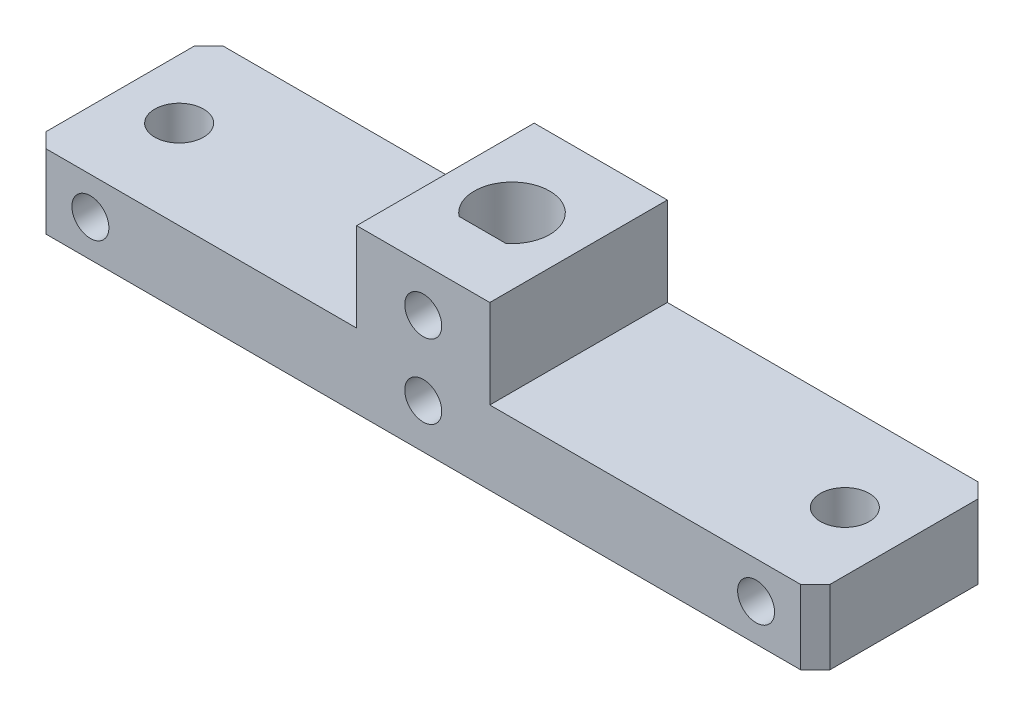
ISO-10303-21;
HEADER;
FILE_DESCRIPTION(('STEP AP214'),'2;1');
FILE_NAME('part.step','',(''),(''),'','','');
FILE_SCHEMA(('AUTOMOTIVE_DESIGN { 1 0 10303 214 1 1 1 1 }'));
ENDSEC;
DATA;
#1=APPLICATION_CONTEXT('core data for automotive mechanical design processes');
#2=APPLICATION_PROTOCOL_DEFINITION('international standard','automotive_design',2000,#1);
#3=PRODUCT_CONTEXT('',#1,'mechanical');
#4=PRODUCT('Part','Part','',(#3));
#5=PRODUCT_RELATED_PRODUCT_CATEGORY('part','',(#4));
#6=PRODUCT_DEFINITION_FORMATION('','',#4);
#7=PRODUCT_DEFINITION_CONTEXT('part definition',#1,'design');
#8=PRODUCT_DEFINITION('design','',#6,#7);
#9=PRODUCT_DEFINITION_SHAPE('','',#8);
#10=(LENGTH_UNIT() NAMED_UNIT(*) SI_UNIT(.MILLI.,.METRE.));
#11=(NAMED_UNIT(*) PLANE_ANGLE_UNIT() SI_UNIT($,.RADIAN.));
#12=(NAMED_UNIT(*) SI_UNIT($,.STERADIAN.) SOLID_ANGLE_UNIT());
#13=UNCERTAINTY_MEASURE_WITH_UNIT(LENGTH_MEASURE(1.E-05),#10,'distance_accuracy_value','');
#14=(GEOMETRIC_REPRESENTATION_CONTEXT(3) GLOBAL_UNCERTAINTY_ASSIGNED_CONTEXT((#13)) GLOBAL_UNIT_ASSIGNED_CONTEXT((#10,
#11,#12)) REPRESENTATION_CONTEXT('',''));
#15=CARTESIAN_POINT('',(0.,0.,0.));
#16=DIRECTION('',(0.,0.,1.));
#17=DIRECTION('',(1.,0.,0.));
#18=AXIS2_PLACEMENT_3D('',#15,#16,#17);
#19=CARTESIAN_POINT('',(4.5,11.,-12.));
#20=DIRECTION('',(0.,1.,0.));
#21=DIRECTION('',(0.,0.,1.));
#22=AXIS2_PLACEMENT_3D('',#19,#20,#21);
#23=PLANE('',#22);
#24=DIRECTION('',(-1.,0.,0.));
#25=VECTOR('',#24,1.);
#26=CARTESIAN_POINT('',(4.5,11.,0.));
#27=LINE('',#26,#25);
#28=CARTESIAN_POINT('',(4.5,11.,0.));
#29=VERTEX_POINT('',#28);
#30=CARTESIAN_POINT('',(-4.5,11.,0.));
#31=VERTEX_POINT('',#30);
#32=EDGE_CURVE('E241',#29,#31,#27,.T.);
#33=ORIENTED_EDGE('',*,*,#32,.F.);
#34=DIRECTION('',(0.,0.,1.));
#35=VECTOR('',#34,1.);
#36=CARTESIAN_POINT('',(4.5,11.,-12.));
#37=LINE('',#36,#35);
#38=CARTESIAN_POINT('',(4.5,11.,-12.));
#39=VERTEX_POINT('',#38);
#40=EDGE_CURVE('E263',#39,#29,#37,.T.);
#41=ORIENTED_EDGE('',*,*,#40,.F.);
#42=DIRECTION('',(-1.,0.,0.));
#43=VECTOR('',#42,1.);
#44=CARTESIAN_POINT('',(4.5,11.,-12.));
#45=LINE('',#44,#43);
#46=CARTESIAN_POINT('',(-4.5,11.,-12.));
#47=VERTEX_POINT('',#46);
#48=EDGE_CURVE('E218',#39,#47,#45,.T.);
#49=ORIENTED_EDGE('',*,*,#48,.T.);
#50=DIRECTION('',(0.,0.,1.));
#51=VECTOR('',#50,1.);
#52=CARTESIAN_POINT('',(-4.5,11.,-12.));
#53=LINE('',#52,#51);
#54=EDGE_CURVE('E260',#47,#31,#53,.T.);
#55=ORIENTED_EDGE('',*,*,#54,.T.);
#56=EDGE_LOOP('',(#33,#41,#49,#55));
#57=FACE_BOUND('',#56,.T.);
#58=DIRECTION('',(1.,0.,0.));
#59=VECTOR('',#58,1.);
#60=CARTESIAN_POINT('',(-1.58192920195564,11.,-4.));
#61=LINE('',#60,#59);
#62=CARTESIAN_POINT('',(-1.58192920195564,11.,-4.));
#63=VERTEX_POINT('',#62);
#64=CARTESIAN_POINT('',(1.58192920195564,11.,-4.));
#65=VERTEX_POINT('',#64);
#66=EDGE_CURVE('E156',#63,#65,#61,.T.);
#67=ORIENTED_EDGE('',*,*,#66,.F.);
#68=CARTESIAN_POINT('',(0.,11.,-6.));
#69=DIRECTION('',(0.,1.,0.));
#70=DIRECTION('',(0.,0.,1.));
#71=AXIS2_PLACEMENT_3D('',#68,#69,#70);
#72=CIRCLE('',#71,2.55);
#73=EDGE_CURVE('E167',#65,#63,#72,.T.);
#74=ORIENTED_EDGE('',*,*,#73,.F.);
#75=EDGE_LOOP('',(#67,#74));
#76=FACE_BOUND('',#75,.T.);
#77=ADVANCED_FACE('F52',(#57,#76),#23,.T.);
#78=CARTESIAN_POINT('',(-26.5,0.,-12.));
#79=DIRECTION('',(0.,-1.,0.));
#80=DIRECTION('',(0.,0.,-1.));
#81=AXIS2_PLACEMENT_3D('',#78,#79,#80);
#82=PLANE('',#81);
#83=CARTESIAN_POINT('',(-22.5,0.,-6.));
#84=DIRECTION('',(0.,-1.,0.));
#85=DIRECTION('',(0.,0.,-1.));
#86=AXIS2_PLACEMENT_3D('',#83,#84,#85);
#87=CIRCLE('',#86,1.64999999999999);
#88=CARTESIAN_POINT('',(-22.5,0.,-7.64999999999999));
#89=VERTEX_POINT('',#88);
#90=EDGE_CURVE('E189',#89,#89,#87,.T.);
#91=ORIENTED_EDGE('',*,*,#90,.F.);
#92=EDGE_LOOP('',(#91));
#93=FACE_BOUND('',#92,.T.);
#94=CARTESIAN_POINT('',(22.5,0.,-6.00000000000001));
#95=DIRECTION('',(0.,-1.,0.));
#96=DIRECTION('',(0.,0.,-1.));
#97=AXIS2_PLACEMENT_3D('',#94,#95,#96);
#98=CIRCLE('',#97,1.64999999999999);
#99=CARTESIAN_POINT('',(22.5,0.,-7.65));
#100=VERTEX_POINT('',#99);
#101=EDGE_CURVE('E197',#100,#100,#98,.T.);
#102=ORIENTED_EDGE('',*,*,#101,.F.);
#103=EDGE_LOOP('',(#102));
#104=FACE_BOUND('',#103,.T.);
#105=DIRECTION('',(0.,0.,1.));
#106=VECTOR('',#105,1.);
#107=CARTESIAN_POINT('',(-26.5,0.,-12.));
#108=LINE('',#107,#106);
#109=CARTESIAN_POINT('',(-26.5,0.,-11.));
#110=VERTEX_POINT('',#109);
#111=CARTESIAN_POINT('',(-26.5,0.,-1.));
#112=VERTEX_POINT('',#111);
#113=EDGE_CURVE('E230',#110,#112,#108,.T.);
#114=ORIENTED_EDGE('',*,*,#113,.F.);
#115=DIRECTION('',(0.707106781186549,0.,-0.707106781186546));
#116=VECTOR('',#115,1.);
#117=CARTESIAN_POINT('',(-26.,0.,-11.5));
#118=LINE('',#117,#116);
#119=CARTESIAN_POINT('',(-25.5,0.,-12.));
#120=VERTEX_POINT('',#119);
#121=EDGE_CURVE('E295',#110,#120,#118,.T.);
#122=ORIENTED_EDGE('',*,*,#121,.T.);
#123=DIRECTION('',(1.,0.,0.));
#124=VECTOR('',#123,1.);
#125=CARTESIAN_POINT('',(-26.5,0.,-12.));
#126=LINE('',#125,#124);
#127=CARTESIAN_POINT('',(25.5,0.,-12.));
#128=VERTEX_POINT('',#127);
#129=EDGE_CURVE('E206',#120,#128,#126,.T.);
#130=ORIENTED_EDGE('',*,*,#129,.T.);
#131=DIRECTION('',(0.70710678118655,0.,0.707106781186545));
#132=VECTOR('',#131,1.);
#133=CARTESIAN_POINT('',(-0.500000000000184,0.,-38.));
#134=LINE('',#133,#132);
#135=CARTESIAN_POINT('',(26.5,0.,-11.));
#136=VERTEX_POINT('',#135);
#137=EDGE_CURVE('E289',#128,#136,#134,.T.);
#138=ORIENTED_EDGE('',*,*,#137,.T.);
#139=DIRECTION('',(0.,0.,1.));
#140=VECTOR('',#139,1.);
#141=CARTESIAN_POINT('',(26.5,0.,-12.));
#142=LINE('',#141,#140);
#143=CARTESIAN_POINT('',(26.5,0.,-1.));
#144=VERTEX_POINT('',#143);
#145=EDGE_CURVE('E273',#136,#144,#142,.T.);
#146=ORIENTED_EDGE('',*,*,#145,.T.);
#147=DIRECTION('',(0.707106781186548,0.,-0.707106781186548));
#148=VECTOR('',#147,1.);
#149=CARTESIAN_POINT('',(5.5,0.,20.));
#150=LINE('',#149,#148);
#151=CARTESIAN_POINT('',(25.5,0.,0.));
#152=VERTEX_POINT('',#151);
#153=EDGE_CURVE('E286',#144,#152,#150,.F.);
#154=ORIENTED_EDGE('',*,*,#153,.T.);
#155=DIRECTION('',(1.,0.,0.));
#156=VECTOR('',#155,1.);
#157=CARTESIAN_POINT('',(-26.5,0.,0.));
#158=LINE('',#157,#156);
#159=CARTESIAN_POINT('',(-25.5,0.,0.));
#160=VERTEX_POINT('',#159);
#161=EDGE_CURVE('E205',#160,#152,#158,.T.);
#162=ORIENTED_EDGE('',*,*,#161,.F.);
#163=DIRECTION('',(0.707106781186544,0.,0.707106781186551));
#164=VECTOR('',#163,1.);
#165=CARTESIAN_POINT('',(-32.,0.,-6.50000000000005));
#166=LINE('',#165,#164);
#167=EDGE_CURVE('E292',#160,#112,#166,.F.);
#168=ORIENTED_EDGE('',*,*,#167,.T.);
#169=EDGE_LOOP('',(#114,#122,#130,#138,#146,#154,#162,#168));
#170=FACE_BOUND('',#169,.T.);
#171=DIRECTION('',(1.,0.,0.));
#172=VECTOR('',#171,1.);
#173=CARTESIAN_POINT('',(-1.58192920195564,0.,-4.));
#174=LINE('',#173,#172);
#175=CARTESIAN_POINT('',(-1.58192920195564,0.,-4.));
#176=VERTEX_POINT('',#175);
#177=CARTESIAN_POINT('',(1.58192920195564,0.,-4.));
#178=VERTEX_POINT('',#177);
#179=EDGE_CURVE('E176',#176,#178,#174,.T.);
#180=ORIENTED_EDGE('',*,*,#179,.T.);
#181=CARTESIAN_POINT('',(0.,0.,-6.));
#182=DIRECTION('',(0.,1.,0.));
#183=DIRECTION('',(0.,0.,1.));
#184=AXIS2_PLACEMENT_3D('',#181,#182,#183);
#185=CIRCLE('',#184,2.55);
#186=EDGE_CURVE('E172',#178,#176,#185,.T.);
#187=ORIENTED_EDGE('',*,*,#186,.T.);
#188=EDGE_LOOP('',(#180,#187));
#189=FACE_BOUND('',#188,.T.);
#190=ADVANCED_FACE('F441',(#93,#104,#170,#189),#82,.T.);
#191=CARTESIAN_POINT('',(-26.5,5.,-12.));
#192=DIRECTION('',(-1.,0.,0.));
#193=DIRECTION('',(0.,-1.,0.));
#194=AXIS2_PLACEMENT_3D('',#191,#192,#193);
#195=PLANE('',#194);
#196=DIRECTION('',(0.,0.,1.));
#197=VECTOR('',#196,1.);
#198=CARTESIAN_POINT('',(-26.5,5.,-12.));
#199=LINE('',#198,#197);
#200=CARTESIAN_POINT('',(-26.5,5.,-11.));
#201=VERTEX_POINT('',#200);
#202=CARTESIAN_POINT('',(-26.5,5.,-1.));
#203=VERTEX_POINT('',#202);
#204=EDGE_CURVE('E252',#201,#203,#199,.T.);
#205=ORIENTED_EDGE('',*,*,#204,.F.);
#206=DIRECTION('',(0.,-1.,0.));
#207=VECTOR('',#206,1.);
#208=CARTESIAN_POINT('',(-26.5,0.,-11.));
#209=LINE('',#208,#207);
#210=EDGE_CURVE('E282',#201,#110,#209,.T.);
#211=ORIENTED_EDGE('',*,*,#210,.T.);
#212=ORIENTED_EDGE('',*,*,#113,.T.);
#213=DIRECTION('',(0.,1.,0.));
#214=VECTOR('',#213,1.);
#215=CARTESIAN_POINT('',(-26.5,5.,-1.));
#216=LINE('',#215,#214);
#217=EDGE_CURVE('E256',#112,#203,#216,.T.);
#218=ORIENTED_EDGE('',*,*,#217,.T.);
#219=EDGE_LOOP('',(#205,#211,#212,#218));
#220=FACE_BOUND('',#219,.T.);
#221=ADVANCED_FACE('F447',(#220),#195,.T.);
#222=CARTESIAN_POINT('',(-4.5,5.,-12.));
#223=DIRECTION('',(0.,1.,0.));
#224=DIRECTION('',(-1.,0.,0.));
#225=AXIS2_PLACEMENT_3D('',#222,#223,#224);
#226=PLANE('',#225);
#227=CARTESIAN_POINT('',(-22.5,5.,-6.));
#228=DIRECTION('',(0.,1.,0.));
#229=DIRECTION('',(-1.,0.,0.));
#230=AXIS2_PLACEMENT_3D('',#227,#228,#229);
#231=CIRCLE('',#230,1.64999999999999);
#232=CARTESIAN_POINT('',(-24.15,5.,-6.));
#233=VERTEX_POINT('',#232);
#234=EDGE_CURVE('E193',#233,#233,#231,.T.);
#235=ORIENTED_EDGE('',*,*,#234,.F.);
#236=EDGE_LOOP('',(#235));
#237=FACE_BOUND('',#236,.T.);
#238=DIRECTION('',(-1.,0.,0.));
#239=VECTOR('',#238,1.);
#240=CARTESIAN_POINT('',(-4.5,5.,-12.));
#241=LINE('',#240,#239);
#242=CARTESIAN_POINT('',(-4.5,5.,-12.));
#243=VERTEX_POINT('',#242);
#244=CARTESIAN_POINT('',(-25.5,5.,-12.));
#245=VERTEX_POINT('',#244);
#246=EDGE_CURVE('E226',#243,#245,#241,.T.);
#247=ORIENTED_EDGE('',*,*,#246,.T.);
#248=DIRECTION('',(-0.707106781186549,0.,0.707106781186546));
#249=VECTOR('',#248,1.);
#250=CARTESIAN_POINT('',(-15.,5.,-22.5));
#251=LINE('',#250,#249);
#252=EDGE_CURVE('E307',#245,#201,#251,.T.);
#253=ORIENTED_EDGE('',*,*,#252,.T.);
#254=ORIENTED_EDGE('',*,*,#204,.T.);
#255=DIRECTION('',(-0.707106781186544,0.,-0.707106781186551));
#256=VECTOR('',#255,1.);
#257=CARTESIAN_POINT('',(-21.0000000000001,5.,4.49999999999994));
#258=LINE('',#257,#256);
#259=CARTESIAN_POINT('',(-25.5,5.,0.));
#260=VERTEX_POINT('',#259);
#261=EDGE_CURVE('E304',#203,#260,#258,.F.);
#262=ORIENTED_EDGE('',*,*,#261,.T.);
#263=DIRECTION('',(-1.,0.,0.));
#264=VECTOR('',#263,1.);
#265=CARTESIAN_POINT('',(-4.5,5.,0.));
#266=LINE('',#265,#264);
#267=CARTESIAN_POINT('',(-4.5,5.,0.));
#268=VERTEX_POINT('',#267);
#269=EDGE_CURVE('E211',#268,#260,#266,.T.);
#270=ORIENTED_EDGE('',*,*,#269,.F.);
#271=DIRECTION('',(0.,0.,1.));
#272=VECTOR('',#271,1.);
#273=CARTESIAN_POINT('',(-4.5,5.,-12.));
#274=LINE('',#273,#272);
#275=EDGE_CURVE('E257',#243,#268,#274,.T.);
#276=ORIENTED_EDGE('',*,*,#275,.F.);
#277=EDGE_LOOP('',(#247,#253,#254,#262,#270,#276));
#278=FACE_BOUND('',#277,.T.);
#279=ADVANCED_FACE('F469',(#237,#278),#226,.T.);
#280=CARTESIAN_POINT('',(-4.5,11.,-12.));
#281=DIRECTION('',(-1.,0.,0.));
#282=DIRECTION('',(0.,-1.,0.));
#283=AXIS2_PLACEMENT_3D('',#280,#281,#282);
#284=PLANE('',#283);
#285=DIRECTION('',(0.,-1.,0.));
#286=VECTOR('',#285,1.);
#287=CARTESIAN_POINT('',(-4.5,11.,0.));
#288=LINE('',#287,#286);
#289=EDGE_CURVE('E245',#31,#268,#288,.T.);
#290=ORIENTED_EDGE('',*,*,#289,.F.);
#291=ORIENTED_EDGE('',*,*,#54,.F.);
#292=DIRECTION('',(0.,-1.,0.));
#293=VECTOR('',#292,1.);
#294=CARTESIAN_POINT('',(-4.5,11.,-12.));
#295=LINE('',#294,#293);
#296=EDGE_CURVE('E222',#47,#243,#295,.T.);
#297=ORIENTED_EDGE('',*,*,#296,.T.);
#298=ORIENTED_EDGE('',*,*,#275,.T.);
#299=EDGE_LOOP('',(#290,#291,#297,#298));
#300=FACE_BOUND('',#299,.T.);
#301=ADVANCED_FACE('F453',(#300),#284,.T.);
#302=CARTESIAN_POINT('',(4.50000000000001,5.,-12.));
#303=DIRECTION('',(1.,0.,0.));
#304=DIRECTION('',(0.,1.,0.));
#305=AXIS2_PLACEMENT_3D('',#302,#303,#304);
#306=PLANE('',#305);
#307=DIRECTION('',(0.,1.,0.));
#308=VECTOR('',#307,1.);
#309=CARTESIAN_POINT('',(4.50000000000001,5.,0.));
#310=LINE('',#309,#308);
#311=CARTESIAN_POINT('',(4.50000000000001,5.,0.));
#312=VERTEX_POINT('',#311);
#313=EDGE_CURVE('E237',#312,#29,#310,.T.);
#314=ORIENTED_EDGE('',*,*,#313,.F.);
#315=DIRECTION('',(0.,0.,1.));
#316=VECTOR('',#315,1.);
#317=CARTESIAN_POINT('',(4.50000000000001,5.,-12.));
#318=LINE('',#317,#316);
#319=CARTESIAN_POINT('',(4.50000000000001,5.,-12.));
#320=VERTEX_POINT('',#319);
#321=EDGE_CURVE('E266',#320,#312,#318,.T.);
#322=ORIENTED_EDGE('',*,*,#321,.F.);
#323=DIRECTION('',(0.,1.,0.));
#324=VECTOR('',#323,1.);
#325=CARTESIAN_POINT('',(4.50000000000001,5.,-12.));
#326=LINE('',#325,#324);
#327=EDGE_CURVE('E214',#320,#39,#326,.T.);
#328=ORIENTED_EDGE('',*,*,#327,.T.);
#329=ORIENTED_EDGE('',*,*,#40,.T.);
#330=EDGE_LOOP('',(#314,#322,#328,#329));
#331=FACE_BOUND('',#330,.T.);
#332=ADVANCED_FACE('F455',(#331),#306,.T.);
#333=CARTESIAN_POINT('',(26.5,5.00000000000003,-12.));
#334=DIRECTION('',(0.,1.,0.));
#335=DIRECTION('',(-1.,0.,0.));
#336=AXIS2_PLACEMENT_3D('',#333,#334,#335);
#337=PLANE('',#336);
#338=CARTESIAN_POINT('',(22.5,5.00000000000003,-6.00000000000001));
#339=DIRECTION('',(0.,1.,0.));
#340=DIRECTION('',(-1.,0.,0.));
#341=AXIS2_PLACEMENT_3D('',#338,#339,#340);
#342=CIRCLE('',#341,1.64999999999999);
#343=CARTESIAN_POINT('',(20.85,5.00000000000003,-6.00000000000001));
#344=VERTEX_POINT('',#343);
#345=EDGE_CURVE('E201',#344,#344,#342,.T.);
#346=ORIENTED_EDGE('',*,*,#345,.F.);
#347=EDGE_LOOP('',(#346));
#348=FACE_BOUND('',#347,.T.);
#349=DIRECTION('',(0.,0.,1.));
#350=VECTOR('',#349,1.);
#351=CARTESIAN_POINT('',(26.5,5.00000000000003,-12.));
#352=LINE('',#351,#350);
#353=CARTESIAN_POINT('',(26.5,5.00000000000003,-11.));
#354=VERTEX_POINT('',#353);
#355=CARTESIAN_POINT('',(26.5,5.00000000000003,-1.));
#356=VERTEX_POINT('',#355);
#357=EDGE_CURVE('E270',#354,#356,#352,.T.);
#358=ORIENTED_EDGE('',*,*,#357,.F.);
#359=DIRECTION('',(-0.70710678118655,0.,-0.707106781186545));
#360=VECTOR('',#359,1.);
#361=CARTESIAN_POINT('',(26.,5.00000000000003,-11.5));
#362=LINE('',#361,#360);
#363=CARTESIAN_POINT('',(25.5,5.00000000000003,-12.));
#364=VERTEX_POINT('',#363);
#365=EDGE_CURVE('E11',#354,#364,#362,.T.);
#366=ORIENTED_EDGE('',*,*,#365,.T.);
#367=DIRECTION('',(-1.,0.,0.));
#368=VECTOR('',#367,1.);
#369=CARTESIAN_POINT('',(26.5,5.00000000000003,-12.));
#370=LINE('',#369,#368);
#371=EDGE_CURVE('E210',#364,#320,#370,.T.);
#372=ORIENTED_EDGE('',*,*,#371,.T.);
#373=ORIENTED_EDGE('',*,*,#321,.T.);
#374=DIRECTION('',(-1.,0.,0.));
#375=VECTOR('',#374,1.);
#376=CARTESIAN_POINT('',(26.5,5.00000000000003,0.));
#377=LINE('',#376,#375);
#378=CARTESIAN_POINT('',(25.5,5.00000000000003,0.));
#379=VERTEX_POINT('',#378);
#380=EDGE_CURVE('E234',#379,#312,#377,.T.);
#381=ORIENTED_EDGE('',*,*,#380,.F.);
#382=DIRECTION('',(-0.707106781186548,0.,0.707106781186548));
#383=VECTOR('',#382,1.);
#384=CARTESIAN_POINT('',(32.,5.00000000000003,-6.5));
#385=LINE('',#384,#383);
#386=EDGE_CURVE('E62',#379,#356,#385,.F.);
#387=ORIENTED_EDGE('',*,*,#386,.T.);
#388=EDGE_LOOP('',(#358,#366,#372,#373,#381,#387));
#389=FACE_BOUND('',#388,.T.);
#390=ADVANCED_FACE('F458',(#348,#389),#337,.T.);
#391=CARTESIAN_POINT('',(26.5,0.,-12.));
#392=DIRECTION('',(1.,0.,0.));
#393=DIRECTION('',(0.,1.,0.));
#394=AXIS2_PLACEMENT_3D('',#391,#392,#393);
#395=PLANE('',#394);
#396=ORIENTED_EDGE('',*,*,#145,.F.);
#397=DIRECTION('',(0.,1.,0.));
#398=VECTOR('',#397,1.);
#399=CARTESIAN_POINT('',(26.5,5.00000000000003,-11.));
#400=LINE('',#399,#398);
#401=EDGE_CURVE('E321',#136,#354,#400,.T.);
#402=ORIENTED_EDGE('',*,*,#401,.T.);
#403=ORIENTED_EDGE('',*,*,#357,.T.);
#404=DIRECTION('',(0.,-1.,0.));
#405=VECTOR('',#404,1.);
#406=CARTESIAN_POINT('',(26.5,0.,-1.));
#407=LINE('',#406,#405);
#408=EDGE_CURVE('E318',#356,#144,#407,.T.);
#409=ORIENTED_EDGE('',*,*,#408,.T.);
#410=EDGE_LOOP('',(#396,#402,#403,#409));
#411=FACE_BOUND('',#410,.T.);
#412=ADVANCED_FACE('F462',(#411),#395,.T.);
#413=CARTESIAN_POINT('',(0.,0.,-12.));
#414=DIRECTION('',(0.,0.,1.));
#415=DIRECTION('',(1.,0.,0.));
#416=AXIS2_PLACEMENT_3D('',#413,#414,#415);
#417=PLANE('',#416);
#418=ORIENTED_EDGE('',*,*,#129,.F.);
#419=DIRECTION('',(0.,1.,0.));
#420=VECTOR('',#419,1.);
#421=CARTESIAN_POINT('',(-25.5,5.,-12.));
#422=LINE('',#421,#420);
#423=EDGE_CURVE('E301',#120,#245,#422,.T.);
#424=ORIENTED_EDGE('',*,*,#423,.T.);
#425=ORIENTED_EDGE('',*,*,#246,.F.);
#426=ORIENTED_EDGE('',*,*,#296,.F.);
#427=ORIENTED_EDGE('',*,*,#48,.F.);
#428=ORIENTED_EDGE('',*,*,#327,.F.);
#429=ORIENTED_EDGE('',*,*,#371,.F.);
#430=DIRECTION('',(0.,-1.,0.));
#431=VECTOR('',#430,1.);
#432=CARTESIAN_POINT('',(25.5,0.,-12.));
#433=LINE('',#432,#431);
#434=EDGE_CURVE('E298',#364,#128,#433,.T.);
#435=ORIENTED_EDGE('',*,*,#434,.T.);
#436=EDGE_LOOP('',(#418,#424,#425,#426,#427,#428,#429,#435));
#437=FACE_BOUND('',#436,.T.);
#438=ADVANCED_FACE('F465',(#437),#417,.F.);
#439=CARTESIAN_POINT('',(0.,0.,0.));
#440=DIRECTION('',(0.,0.,1.));
#441=DIRECTION('',(1.,0.,0.));
#442=AXIS2_PLACEMENT_3D('',#439,#440,#441);
#443=PLANE('',#442);
#444=CARTESIAN_POINT('',(-22.5,2.50000000000003,0.));
#445=DIRECTION('',(0.,0.,1.));
#446=DIRECTION('',(1.,0.,0.));
#447=AXIS2_PLACEMENT_3D('',#444,#445,#446);
#448=CIRCLE('',#447,1.24999999999999);
#449=CARTESIAN_POINT('',(-21.25,2.50000000000003,0.));
#450=VERTEX_POINT('',#449);
#451=EDGE_CURVE('E410',#450,#450,#448,.T.);
#452=ORIENTED_EDGE('',*,*,#451,.F.);
#453=EDGE_LOOP('',(#452));
#454=FACE_BOUND('',#453,.T.);
#455=CARTESIAN_POINT('',(22.5,2.50000000000003,0.));
#456=DIRECTION('',(0.,0.,1.));
#457=DIRECTION('',(1.,0.,0.));
#458=AXIS2_PLACEMENT_3D('',#455,#456,#457);
#459=CIRCLE('',#458,1.24999999999999);
#460=CARTESIAN_POINT('',(23.75,2.50000000000003,0.));
#461=VERTEX_POINT('',#460);
#462=EDGE_CURVE('E400',#461,#461,#459,.T.);
#463=ORIENTED_EDGE('',*,*,#462,.F.);
#464=EDGE_LOOP('',(#463));
#465=FACE_BOUND('',#464,.T.);
#466=CARTESIAN_POINT('',(0.,8.00000000000001,0.));
#467=DIRECTION('',(0.,0.,1.));
#468=DIRECTION('',(1.,0.,0.));
#469=AXIS2_PLACEMENT_3D('',#466,#467,#468);
#470=CIRCLE('',#469,1.24999999999999);
#471=CARTESIAN_POINT('',(1.24999999999999,8.00000000000001,0.));
#472=VERTEX_POINT('',#471);
#473=EDGE_CURVE('E390',#472,#472,#470,.T.);
#474=ORIENTED_EDGE('',*,*,#473,.F.);
#475=EDGE_LOOP('',(#474));
#476=FACE_BOUND('',#475,.T.);
#477=CARTESIAN_POINT('',(0.,3.,0.));
#478=DIRECTION('',(0.,0.,1.));
#479=DIRECTION('',(1.,0.,0.));
#480=AXIS2_PLACEMENT_3D('',#477,#478,#479);
#481=CIRCLE('',#480,1.24999999999999);
#482=CARTESIAN_POINT('',(1.24999999999999,3.,0.));
#483=VERTEX_POINT('',#482);
#484=EDGE_CURVE('E379',#483,#483,#481,.T.);
#485=ORIENTED_EDGE('',*,*,#484,.F.);
#486=EDGE_LOOP('',(#485));
#487=FACE_BOUND('',#486,.T.);
#488=ORIENTED_EDGE('',*,*,#269,.T.);
#489=DIRECTION('',(0.,-1.,0.));
#490=VECTOR('',#489,1.);
#491=CARTESIAN_POINT('',(-25.5,0.,0.));
#492=LINE('',#491,#490);
#493=EDGE_CURVE('E314',#260,#160,#492,.T.);
#494=ORIENTED_EDGE('',*,*,#493,.T.);
#495=ORIENTED_EDGE('',*,*,#161,.T.);
#496=DIRECTION('',(0.,1.,0.));
#497=VECTOR('',#496,1.);
#498=CARTESIAN_POINT('',(25.5,0.,0.));
#499=LINE('',#498,#497);
#500=EDGE_CURVE('E310',#152,#379,#499,.T.);
#501=ORIENTED_EDGE('',*,*,#500,.T.);
#502=ORIENTED_EDGE('',*,*,#380,.T.);
#503=ORIENTED_EDGE('',*,*,#313,.T.);
#504=ORIENTED_EDGE('',*,*,#32,.T.);
#505=ORIENTED_EDGE('',*,*,#289,.T.);
#506=EDGE_LOOP('',(#488,#494,#495,#501,#502,#503,#504,#505));
#507=FACE_BOUND('',#506,.T.);
#508=ADVANCED_FACE('F500',(#454,#465,#476,#487,#507),#443,.T.);
#509=CARTESIAN_POINT('',(22.5,0.,-6.00000000000001));
#510=DIRECTION('',(0.,-1.,0.));
#511=DIRECTION('',(0.,0.,-1.));
#512=AXIS2_PLACEMENT_3D('',#509,#510,#511);
#513=CYLINDRICAL_SURFACE('',#512,1.64999999999999);
#514=CARTESIAN_POINT('',(23.75,2.50000000000003,-4.92296703857311));
#515=CARTESIAN_POINT('',(23.7499921483348,2.55804444947865,-4.9229506207044));
#516=CARTESIAN_POINT('',(23.7459045043683,2.61615010984884,-4.91815796381316));
#517=CARTESIAN_POINT('',(23.7300143019573,2.73000921003107,-4.90013950186176));
#518=CARTESIAN_POINT('',(23.71818411429,2.78575346177427,-4.88688349956445));
#519=CARTESIAN_POINT('',(23.68465710464,2.9045275214471,-4.85117667918063));
#520=CARTESIAN_POINT('',(23.6614345663849,2.96670753358605,-4.82739784255901));
#521=CARTESIAN_POINT('',(23.6065157798252,3.08514856837618,-4.77543690815317));
#522=CARTESIAN_POINT('',(23.5748083158257,3.14140161837279,-4.74724900293594));
#523=CARTESIAN_POINT('',(23.5027639216693,3.24917223550719,-4.68882921463891));
#524=CARTESIAN_POINT('',(23.4622428748645,3.30054865524437,-4.65856498290385));
#525=CARTESIAN_POINT('',(23.3733781324916,3.39665360876358,-4.59908283015536));
#526=CARTESIAN_POINT('',(23.32504118386,3.44138781299345,-4.56986403302234));
#527=CARTESIAN_POINT('',(23.2229582143096,3.52169800074396,-4.51573998036955));
#528=CARTESIAN_POINT('',(23.1695231151998,3.55757884643994,-4.49070539859495));
#529=CARTESIAN_POINT('',(23.0561837071499,3.62132977676979,-4.44536855952226));
#530=CARTESIAN_POINT('',(22.9962807463545,3.64920152638179,-4.42506531881124));
#531=CARTESIAN_POINT('',(22.8705523445062,3.69570798998144,-4.39081775286639));
#532=CARTESIAN_POINT('',(22.8046782771455,3.71425695876182,-4.3769325470547));
#533=CARTESIAN_POINT('',(22.6696270530949,3.74033761016006,-4.35733101137912));
#534=CARTESIAN_POINT('',(22.6004542420776,3.74788339544632,-4.35160422516909));
#535=CARTESIAN_POINT('',(22.4723010114039,3.75107947180414,-4.34918155835974));
#536=CARTESIAN_POINT('',(22.4133772633778,3.74837036924069,-4.35124010682931));
#537=CARTESIAN_POINT('',(22.2970295910036,3.73480014646176,-4.36149114691154));
#538=CARTESIAN_POINT('',(22.2396056973932,3.72393885931194,-4.36968376413306));
#539=CARTESIAN_POINT('',(22.1295466032159,3.69515890437942,-4.39117532342631));
#540=CARTESIAN_POINT('',(22.0768185270377,3.67746703813317,-4.40430985009125));
#541=CARTESIAN_POINT('',(21.9752154394935,3.63583372063106,-4.43477882554458));
#542=CARTESIAN_POINT('',(21.9263410999158,3.61189118287245,-4.45211400446008));
#543=CARTESIAN_POINT('',(21.8268673347571,3.5550332599328,-4.49247196828303));
#544=CARTESIAN_POINT('',(21.7768912202744,3.52135076758441,-4.51594341289907));
#545=CARTESIAN_POINT('',(21.6830053100023,3.44793370033148,-4.5654813670753));
#546=CARTESIAN_POINT('',(21.6391027922312,3.4081919824164,-4.59155092673296));
#547=CARTESIAN_POINT('',(21.5493096071294,3.31468226190858,-4.65014409939101));
#548=CARTESIAN_POINT('',(21.5048287718293,3.25970520804199,-4.6829024759048));
#549=CARTESIAN_POINT('',(21.4253747416773,3.1424155087261,-4.74689470938858));
#550=CARTESIAN_POINT('',(21.390399407328,3.08010451853082,-4.77812890811966));
#551=CARTESIAN_POINT('',(21.3392287078819,2.96671138095956,-4.82697254482192));
#552=CARTESIAN_POINT('',(21.320516699323,2.91736084078879,-4.84594970306178));
#553=CARTESIAN_POINT('',(21.2892141947835,2.81517834637323,-4.87883303402231));
#554=CARTESIAN_POINT('',(21.2766091127434,2.76235503314396,-4.89275126962476));
#555=CARTESIAN_POINT('',(21.2597432392205,2.66251402167054,-4.91169787402625));
#556=CARTESIAN_POINT('',(21.2544904872187,2.61586895469849,-4.91777126377215));
#557=CARTESIAN_POINT('',(21.2493084769088,2.52190040120287,-4.92376159857673));
#558=CARTESIAN_POINT('',(21.2493751017824,2.47457746766079,-4.92368330460056));
#559=CARTESIAN_POINT('',(21.254813533365,2.3807655995133,-4.91739899374116));
#560=CARTESIAN_POINT('',(21.2601751416252,2.33427523657488,-4.91120475652845));
#561=CARTESIAN_POINT('',(21.2758045634883,2.24310908867572,-4.89366336202432));
#562=CARTESIAN_POINT('',(21.2860804052011,2.19843640319617,-4.88230777443228));
#563=CARTESIAN_POINT('',(21.3169393044194,2.0909684439707,-4.84953116694612));
#564=CARTESIAN_POINT('',(21.3400987884373,2.02960060674871,-4.82588990813099));
#565=CARTESIAN_POINT('',(21.3947096365856,1.91261529429815,-4.77433778131764));
#566=CARTESIAN_POINT('',(21.4261794906778,1.85701103160991,-4.74641745156454));
#567=CARTESIAN_POINT('',(21.4980890223282,1.74966770667783,-4.68816992406905));
#568=CARTESIAN_POINT('',(21.5388220683879,1.69815331160214,-4.65779167331221));
#569=CARTESIAN_POINT('',(21.6281616306927,1.6018316151378,-4.5981144413706));
#570=CARTESIAN_POINT('',(21.6767607141792,1.55701805817057,-4.56881447306689));
#571=CARTESIAN_POINT('',(21.7791567000529,1.47681333506509,-4.51471221043868));
#572=CARTESIAN_POINT('',(21.832606128983,1.44108055229445,-4.48976400217105));
#573=CARTESIAN_POINT('',(21.945945368773,1.37762085297279,-4.44460986928411));
#574=CARTESIAN_POINT('',(22.0058337068485,1.34989211096581,-4.42440286355098));
#575=CARTESIAN_POINT('',(22.1314977532872,1.30366308150324,-4.39034938963644));
#576=CARTESIAN_POINT('',(22.1973216091278,1.28524812064195,-4.37656181997917));
#577=CARTESIAN_POINT('',(22.3322392280232,1.25941340229611,-4.35714256503414));
#578=CARTESIAN_POINT('',(22.4013287615145,1.25197980422693,-4.3515006134543));
#579=CARTESIAN_POINT('',(22.529350886145,1.2489599406898,-4.34921140182062));
#580=CARTESIAN_POINT('',(22.5882306720728,1.25174425901288,-4.35132702126895));
#581=CARTESIAN_POINT('',(22.7044769091747,1.26545041798848,-4.36168008674012));
#582=CARTESIAN_POINT('',(22.761843324758,1.27637244984458,-4.36991767660467));
#583=CARTESIAN_POINT('',(22.8718322990899,1.30526904869321,-4.39149347811575));
#584=CARTESIAN_POINT('',(22.9245452767978,1.32302377595238,-4.40467239408094));
#585=CARTESIAN_POINT('',(23.0261087166898,1.36477878746096,-4.43522365419493));
#586=CARTESIAN_POINT('',(23.0749585389146,1.38878010368837,-4.45259669120604));
#587=CARTESIAN_POINT('',(23.1743975235441,1.44577292505409,-4.49303695343917));
#588=CARTESIAN_POINT('',(23.2243599214621,1.47953416492724,-4.51655361498786));
#589=CARTESIAN_POINT('',(23.3182090672306,1.55311204664981,-4.56617352697844));
#590=CARTESIAN_POINT('',(23.3620882825053,1.59293607009003,-4.59227991679348));
#591=CARTESIAN_POINT('',(23.4518198676369,1.68663290778313,-4.65094058480455));
#592=CARTESIAN_POINT('',(23.4962594725216,1.74171583289152,-4.68372662901874));
#593=CARTESIAN_POINT('',(23.5756087810991,1.859226648595,-4.7477403372383));
#594=CARTESIAN_POINT('',(23.610521350171,1.92165232266237,-4.77896846749217));
#595=CARTESIAN_POINT('',(23.6611885891877,2.0344207941389,-4.8273998448553));
#596=CARTESIAN_POINT('',(23.6795605493218,2.08296851416475,-4.84603561629843));
#597=CARTESIAN_POINT('',(23.7103798523986,2.18342058250486,-4.87840184704849));
#598=CARTESIAN_POINT('',(23.7228438629348,2.23531501275546,-4.89214607877288));
#599=CARTESIAN_POINT('',(23.7378976983118,2.32297633950967,-4.90904207401908));
#600=CARTESIAN_POINT('',(23.7424169345119,2.35802573293143,-4.91421777596368));
#601=CARTESIAN_POINT('',(23.7484700554353,2.42870916858682,-4.92118480042882));
#602=CARTESIAN_POINT('',(23.7500048233131,2.46434303471657,-4.92297712414339));
#603=CARTESIAN_POINT('',(23.75,2.50000000000003,-4.92296703857311));
#604=B_SPLINE_CURVE_WITH_KNOTS('',3,(#514,#515,#516,#517,#518,#519,#520,#521,#522,#523,#524,
#525,#526,#527,#528,#529,#530,#531,#532,#533,#534,#535,#536,#537,#538,#539,#540,#541,#542,#543,
#544,#545,#546,#547,#548,#549,#550,#551,#552,#553,#554,#555,#556,#557,#558,#559,#560,#561,#562,
#563,#564,#565,#566,#567,#568,#569,#570,#571,#572,#573,#574,#575,#576,#577,#578,#579,#580,#581,
#582,#583,#584,#585,#586,#587,#588,#589,#590,#591,#592,#593,#594,#595,#596,#597,#598,#599,#600,
#601,#602,#603),.UNSPECIFIED.,.T.,.F.,(4,2,2,2,2,2,2,2,2,2,2,2,2,2,2,2,2,2,2,2,2,2,2,2,2,2,2,2,
2,2,2,2,2,2,2,2,2,2,2,2,2,2,2,2,4),(0.,0.173943729769854,0.348511586230431,0.558873505777453,
0.769514875049401,0.985071957641446,1.20044394822191,1.40680504221085,1.61312320555187,
1.82130573701369,2.02922120779732,2.20538556553905,2.38155353074103,2.55231534497561,
2.72310686111549,2.91643423713942,3.10999130790663,3.34289234053262,3.57574090832049,
3.74348543345525,3.91082731025695,4.052177113185,4.19341752250922,4.33438642402424,
4.47558640939241,4.6836023224329,4.89208501310437,5.10842541382385,5.32456257144978,
5.53063397616701,5.73665834563818,5.94453745280214,6.1521543310892,6.32820548538653,
6.50426077630955,6.67507019125498,6.84590784298307,7.0393754968439,7.23308061458988,
7.46617013637419,7.69918947601728,7.86416129222448,8.02866487584162,8.13555092229449,
8.24240533454907),.UNSPECIFIED.);
#605=CARTESIAN_POINT('',(23.75,2.50000000000003,-4.92296703857311));
#606=VERTEX_POINT('',#605);
#607=EDGE_CURVE('E395',#606,#606,#604,.T.);
#608=ORIENTED_EDGE('',*,*,#607,.T.);
#609=EDGE_LOOP('',(#608));
#610=FACE_BOUND('',#609,.T.);
#611=ORIENTED_EDGE('',*,*,#101,.T.);
#612=EDGE_LOOP('',(#611));
#613=FACE_BOUND('',#612,.T.);
#614=ORIENTED_EDGE('',*,*,#345,.T.);
#615=EDGE_LOOP('',(#614));
#616=FACE_BOUND('',#615,.T.);
#617=ADVANCED_FACE('F529',(#610,#613,#616),#513,.F.);
#618=CARTESIAN_POINT('',(-22.5,0.,-6.));
#619=DIRECTION('',(0.,-1.,0.));
#620=DIRECTION('',(0.,0.,-1.));
#621=AXIS2_PLACEMENT_3D('',#618,#619,#620);
#622=CYLINDRICAL_SURFACE('',#621,1.64999999999999);
#623=CARTESIAN_POINT('',(-21.25,2.50000000000003,-4.9229670385731));
#624=CARTESIAN_POINT('',(-21.2500078516652,2.55804444947865,-4.92295062070439));
#625=CARTESIAN_POINT('',(-21.2540954956317,2.61615010984884,-4.91815796381315));
#626=CARTESIAN_POINT('',(-21.2699856980427,2.73000921003107,-4.90013950186175));
#627=CARTESIAN_POINT('',(-21.28181588571,2.78575346177427,-4.88688349956445));
#628=CARTESIAN_POINT('',(-21.31534289536,2.9045275214471,-4.85117667918063));
#629=CARTESIAN_POINT('',(-21.3385654336151,2.96670753358605,-4.82739784255899));
#630=CARTESIAN_POINT('',(-21.3934842201748,3.08514856837618,-4.77543690815316));
#631=CARTESIAN_POINT('',(-21.4251916841743,3.14140161837279,-4.74724900293593));
#632=CARTESIAN_POINT('',(-21.4972360783307,3.24917223550719,-4.6888292146389));
#633=CARTESIAN_POINT('',(-21.5377571251355,3.30054865524437,-4.65856498290384));
#634=CARTESIAN_POINT('',(-21.6266218675083,3.39665360876357,-4.59908283015535));
#635=CARTESIAN_POINT('',(-21.67495881614,3.44138781299345,-4.56986403302233));
#636=CARTESIAN_POINT('',(-21.7770417856904,3.52169800074396,-4.51573998036954));
#637=CARTESIAN_POINT('',(-21.8304768848002,3.55757884643993,-4.49070539859494));
#638=CARTESIAN_POINT('',(-21.9438162928501,3.62132977676979,-4.44536855952225));
#639=CARTESIAN_POINT('',(-22.0037192536455,3.64920152638179,-4.42506531881123));
#640=CARTESIAN_POINT('',(-22.1294476554938,3.69570798998144,-4.39081775286638));
#641=CARTESIAN_POINT('',(-22.1953217228545,3.71425695876182,-4.37693254705469));
#642=CARTESIAN_POINT('',(-22.3303729469051,3.74033761016006,-4.3573310113791));
#643=CARTESIAN_POINT('',(-22.3995457579224,3.74788339544632,-4.35160422516908));
#644=CARTESIAN_POINT('',(-22.5276989885961,3.75107947180414,-4.34918155835973));
#645=CARTESIAN_POINT('',(-22.5866227366222,3.74837036924069,-4.35124010682929));
#646=CARTESIAN_POINT('',(-22.7029704089964,3.73480014646176,-4.36149114691152));
#647=CARTESIAN_POINT('',(-22.7603943026068,3.72393885931194,-4.36968376413305));
#648=CARTESIAN_POINT('',(-22.8704533967841,3.69515890437942,-4.3911753234263));
#649=CARTESIAN_POINT('',(-22.9231814729623,3.67746703813317,-4.40430985009124));
#650=CARTESIAN_POINT('',(-23.0247845605065,3.63583372063105,-4.43477882554456));
#651=CARTESIAN_POINT('',(-23.0736589000842,3.61189118287245,-4.45211400446007));
#652=CARTESIAN_POINT('',(-23.1731326652429,3.5550332599328,-4.49247196828302));
#653=CARTESIAN_POINT('',(-23.2231087797256,3.52135076758441,-4.51594341289906));
#654=CARTESIAN_POINT('',(-23.3169946899977,3.44793370033148,-4.56548136707528));
#655=CARTESIAN_POINT('',(-23.3608972077688,3.4081919824164,-4.59155092673295));
#656=CARTESIAN_POINT('',(-23.4506903928706,3.31468226190857,-4.650144099391));
#657=CARTESIAN_POINT('',(-23.4951712281707,3.25970520804199,-4.68290247590479));
#658=CARTESIAN_POINT('',(-23.5746252583227,3.14241550872609,-4.74689470938857));
#659=CARTESIAN_POINT('',(-23.609600592672,3.08010451853082,-4.77812890811966));
#660=CARTESIAN_POINT('',(-23.6607712921181,2.96671138095956,-4.82697254482191));
#661=CARTESIAN_POINT('',(-23.679483300677,2.91736084078879,-4.84594970306176));
#662=CARTESIAN_POINT('',(-23.7107858052165,2.81517834637323,-4.87883303402229));
#663=CARTESIAN_POINT('',(-23.7233908872566,2.76235503314396,-4.89275126962475));
#664=CARTESIAN_POINT('',(-23.7402567607795,2.66251402167054,-4.91169787402624));
#665=CARTESIAN_POINT('',(-23.7455095127813,2.61586895469849,-4.91777126377213));
#666=CARTESIAN_POINT('',(-23.7506915230912,2.52190040120287,-4.92376159857671));
#667=CARTESIAN_POINT('',(-23.7506248982176,2.47457746766079,-4.92368330460055));
#668=CARTESIAN_POINT('',(-23.745186466635,2.3807655995133,-4.91739899374115));
#669=CARTESIAN_POINT('',(-23.7398248583748,2.33427523657488,-4.91120475652844));
#670=CARTESIAN_POINT('',(-23.7241954365117,2.24310908867572,-4.89366336202431));
#671=CARTESIAN_POINT('',(-23.7139195947989,2.19843640319617,-4.88230777443227));
#672=CARTESIAN_POINT('',(-23.6830606955806,2.0909684439707,-4.84953116694611));
#673=CARTESIAN_POINT('',(-23.6599012115627,2.02960060674871,-4.82588990813098));
#674=CARTESIAN_POINT('',(-23.6052903634144,1.91261529429815,-4.77433778131763));
#675=CARTESIAN_POINT('',(-23.5738205093222,1.85701103160991,-4.74641745156453));
#676=CARTESIAN_POINT('',(-23.5019109776718,1.74966770667783,-4.68816992406905));
#677=CARTESIAN_POINT('',(-23.4611779316121,1.69815331160214,-4.6577916733122));
#678=CARTESIAN_POINT('',(-23.3718383693073,1.60183161513781,-4.59811444137058));
#679=CARTESIAN_POINT('',(-23.3232392858208,1.55701805817057,-4.56881447306689));
#680=CARTESIAN_POINT('',(-23.2208432999471,1.47681333506509,-4.51471221043868));
#681=CARTESIAN_POINT('',(-23.167393871017,1.44108055229445,-4.48976400217104));
#682=CARTESIAN_POINT('',(-23.054054631227,1.37762085297279,-4.4446098692841));
#683=CARTESIAN_POINT('',(-22.9941662931515,1.34989211096581,-4.42440286355097));
#684=CARTESIAN_POINT('',(-22.8685022467128,1.30366308150324,-4.39034938963643));
#685=CARTESIAN_POINT('',(-22.8026783908721,1.28524812064195,-4.37656181997915));
#686=CARTESIAN_POINT('',(-22.6677607719768,1.25941340229611,-4.35714256503413));
#687=CARTESIAN_POINT('',(-22.5986712384855,1.25197980422693,-4.3515006134543));
#688=CARTESIAN_POINT('',(-22.470649113855,1.2489599406898,-4.34921140182062));
#689=CARTESIAN_POINT('',(-22.4117693279272,1.25174425901288,-4.35132702126894));
#690=CARTESIAN_POINT('',(-22.2955230908253,1.26545041798848,-4.36168008674011));
#691=CARTESIAN_POINT('',(-22.238156675242,1.27637244984458,-4.36991767660467));
#692=CARTESIAN_POINT('',(-22.1281677009101,1.30526904869321,-4.39149347811575));
#693=CARTESIAN_POINT('',(-22.0754547232022,1.32302377595238,-4.40467239408092));
#694=CARTESIAN_POINT('',(-21.9738912833102,1.36477878746096,-4.43522365419492));
#695=CARTESIAN_POINT('',(-21.9250414610854,1.38878010368837,-4.45259669120603));
#696=CARTESIAN_POINT('',(-21.8256024764559,1.44577292505409,-4.49303695343916));
#697=CARTESIAN_POINT('',(-21.7756400785379,1.47953416492724,-4.51655361498785));
#698=CARTESIAN_POINT('',(-21.6817909327694,1.55311204664981,-4.56617352697843));
#699=CARTESIAN_POINT('',(-21.6379117174947,1.59293607009003,-4.59227991679347));
#700=CARTESIAN_POINT('',(-21.5481801323631,1.68663290778313,-4.65094058480454));
#701=CARTESIAN_POINT('',(-21.5037405274784,1.74171583289152,-4.68372662901873));
#702=CARTESIAN_POINT('',(-21.4243912189009,1.859226648595,-4.74774033723829));
#703=CARTESIAN_POINT('',(-21.389478649829,1.92165232266237,-4.77896846749217));
#704=CARTESIAN_POINT('',(-21.3388114108123,2.0344207941389,-4.82739984485529));
#705=CARTESIAN_POINT('',(-21.3204394506782,2.08296851416475,-4.84603561629841));
#706=CARTESIAN_POINT('',(-21.2896201476014,2.18342058250486,-4.87840184704848));
#707=CARTESIAN_POINT('',(-21.2771561370652,2.23531501275546,-4.89214607877288));
#708=CARTESIAN_POINT('',(-21.2621023016882,2.32297633950967,-4.90904207401907));
#709=CARTESIAN_POINT('',(-21.2575830654881,2.35802573293143,-4.91421777596366));
#710=CARTESIAN_POINT('',(-21.2515299445647,2.42870916858682,-4.9211848004288));
#711=CARTESIAN_POINT('',(-21.2499951766869,2.46434303471657,-4.92297712414338));
#712=CARTESIAN_POINT('',(-21.25,2.50000000000003,-4.9229670385731));
#713=B_SPLINE_CURVE_WITH_KNOTS('',3,(#623,#624,#625,#626,#627,#628,#629,#630,#631,#632,#633,
#634,#635,#636,#637,#638,#639,#640,#641,#642,#643,#644,#645,#646,#647,#648,#649,#650,#651,#652,
#653,#654,#655,#656,#657,#658,#659,#660,#661,#662,#663,#664,#665,#666,#667,#668,#669,#670,#671,
#672,#673,#674,#675,#676,#677,#678,#679,#680,#681,#682,#683,#684,#685,#686,#687,#688,#689,#690,
#691,#692,#693,#694,#695,#696,#697,#698,#699,#700,#701,#702,#703,#704,#705,#706,#707,#708,#709,
#710,#711,#712),.UNSPECIFIED.,.T.,.F.,(4,2,2,2,2,2,2,2,2,2,2,2,2,2,2,2,2,2,2,2,2,2,2,2,2,2,2,2,
2,2,2,2,2,2,2,2,2,2,2,2,2,2,2,2,4),(0.,0.173943729769854,0.34851158623043,0.558873505777452,
0.7695148750494,0.98507195764144,1.20044394822191,1.40680504221084,1.61312320555187,
1.82130573701369,2.02922120779732,2.20538556553905,2.38155353074103,2.55231534497562,
2.72310686111549,2.91643423713942,3.10999130790663,3.34289234053263,3.5757409083205,
3.74348543345525,3.91082731025696,4.052177113185,4.19341752250922,4.33438642402424,
4.47558640939241,4.6836023224329,4.89208501310437,5.10842541382384,5.32456257144978,
5.530633976167,5.73665834563818,5.94453745280214,6.1521543310892,6.32820548538654,
6.50426077630956,6.67507019125499,6.84590784298308,7.03937549684391,7.23308061458988,
7.46617013637419,7.69918947601729,7.86416129222449,8.02866487584163,8.13555092229449,
8.24240533454907),.UNSPECIFIED.);
#714=CARTESIAN_POINT('',(-21.25,2.50000000000003,-4.9229670385731));
#715=VERTEX_POINT('',#714);
#716=EDGE_CURVE('E405',#715,#715,#713,.T.);
#717=ORIENTED_EDGE('',*,*,#716,.T.);
#718=EDGE_LOOP('',(#717));
#719=FACE_BOUND('',#718,.T.);
#720=ORIENTED_EDGE('',*,*,#90,.T.);
#721=EDGE_LOOP('',(#720));
#722=FACE_BOUND('',#721,.T.);
#723=ORIENTED_EDGE('',*,*,#234,.T.);
#724=EDGE_LOOP('',(#723));
#725=FACE_BOUND('',#724,.T.);
#726=ADVANCED_FACE('F535',(#719,#722,#725),#622,.F.);
#727=CARTESIAN_POINT('',(0.,11.,-6.));
#728=DIRECTION('',(0.,-1.,0.));
#729=DIRECTION('',(0.,0.,-1.));
#730=AXIS2_PLACEMENT_3D('',#727,#728,#729);
#731=CYLINDRICAL_SURFACE('',#730,2.55);
#732=ORIENTED_EDGE('',*,*,#186,.F.);
#733=DIRECTION('',(0.,-1.,0.));
#734=VECTOR('',#733,1.);
#735=CARTESIAN_POINT('',(1.58192920195564,11.,-4.));
#736=LINE('',#735,#734);
#737=EDGE_CURVE('E159',#65,#178,#736,.T.);
#738=ORIENTED_EDGE('',*,*,#737,.F.);
#739=ORIENTED_EDGE('',*,*,#73,.T.);
#740=DIRECTION('',(0.,-1.,0.));
#741=VECTOR('',#740,1.);
#742=CARTESIAN_POINT('',(-1.58192920195564,11.,-4.));
#743=LINE('',#742,#741);
#744=EDGE_CURVE('E162',#63,#176,#743,.T.);
#745=ORIENTED_EDGE('',*,*,#744,.T.);
#746=EDGE_LOOP('',(#732,#738,#739,#745));
#747=FACE_BOUND('',#746,.T.);
#748=ADVANCED_FACE('F170',(#747),#731,.F.);
#749=CARTESIAN_POINT('',(-1.58192920195564,11.,-4.));
#750=DIRECTION('',(0.,0.,-1.));
#751=DIRECTION('',(-1.,0.,0.));
#752=AXIS2_PLACEMENT_3D('',#749,#750,#751);
#753=PLANE('',#752);
#754=CARTESIAN_POINT('',(0.,8.00000000000001,-4.));
#755=DIRECTION('',(0.,0.,-1.));
#756=DIRECTION('',(-1.,0.,0.));
#757=AXIS2_PLACEMENT_3D('',#754,#755,#756);
#758=CIRCLE('',#757,1.24999999999999);
#759=CARTESIAN_POINT('',(-1.24999999999999,8.00000000000001,-4.));
#760=VERTEX_POINT('',#759);
#761=EDGE_CURVE('E382',#760,#760,#758,.T.);
#762=ORIENTED_EDGE('',*,*,#761,.F.);
#763=EDGE_LOOP('',(#762));
#764=FACE_BOUND('',#763,.T.);
#765=CARTESIAN_POINT('',(0.,3.,-4.));
#766=DIRECTION('',(0.,0.,-1.));
#767=DIRECTION('',(-1.,0.,0.));
#768=AXIS2_PLACEMENT_3D('',#765,#766,#767);
#769=CIRCLE('',#768,1.24999999999999);
#770=CARTESIAN_POINT('',(-1.24999999999999,3.,-4.));
#771=VERTEX_POINT('',#770);
#772=EDGE_CURVE('E182',#771,#771,#769,.T.);
#773=ORIENTED_EDGE('',*,*,#772,.F.);
#774=EDGE_LOOP('',(#773));
#775=FACE_BOUND('',#774,.T.);
#776=ORIENTED_EDGE('',*,*,#179,.F.);
#777=ORIENTED_EDGE('',*,*,#744,.F.);
#778=ORIENTED_EDGE('',*,*,#66,.T.);
#779=ORIENTED_EDGE('',*,*,#737,.T.);
#780=EDGE_LOOP('',(#776,#777,#778,#779));
#781=FACE_BOUND('',#780,.T.);
#782=ADVANCED_FACE('F158',(#764,#775,#781),#753,.T.);
#783=CARTESIAN_POINT('',(0.,3.,0.));
#784=DIRECTION('',(0.,0.,1.));
#785=DIRECTION('',(1.,0.,0.));
#786=AXIS2_PLACEMENT_3D('',#783,#784,#785);
#787=CYLINDRICAL_SURFACE('',#786,1.24999999999999);
#788=ORIENTED_EDGE('',*,*,#484,.T.);
#789=EDGE_LOOP('',(#788));
#790=FACE_BOUND('',#789,.T.);
#791=ORIENTED_EDGE('',*,*,#772,.T.);
#792=EDGE_LOOP('',(#791));
#793=FACE_BOUND('',#792,.T.);
#794=ADVANCED_FACE('F544',(#790,#793),#787,.F.);
#795=CARTESIAN_POINT('',(0.,8.00000000000001,0.));
#796=DIRECTION('',(0.,0.,1.));
#797=DIRECTION('',(1.,0.,0.));
#798=AXIS2_PLACEMENT_3D('',#795,#796,#797);
#799=CYLINDRICAL_SURFACE('',#798,1.24999999999999);
#800=ORIENTED_EDGE('',*,*,#473,.T.);
#801=EDGE_LOOP('',(#800));
#802=FACE_BOUND('',#801,.T.);
#803=ORIENTED_EDGE('',*,*,#761,.T.);
#804=EDGE_LOOP('',(#803));
#805=FACE_BOUND('',#804,.T.);
#806=ADVANCED_FACE('F437',(#802,#805),#799,.F.);
#807=CARTESIAN_POINT('',(22.5,2.50000000000003,0.));
#808=DIRECTION('',(0.,0.,1.));
#809=DIRECTION('',(1.,0.,0.));
#810=AXIS2_PLACEMENT_3D('',#807,#808,#809);
#811=CYLINDRICAL_SURFACE('',#810,1.24999999999999);
#812=ORIENTED_EDGE('',*,*,#607,.F.);
#813=EDGE_LOOP('',(#812));
#814=FACE_BOUND('',#813,.T.);
#815=ORIENTED_EDGE('',*,*,#462,.T.);
#816=EDGE_LOOP('',(#815));
#817=FACE_BOUND('',#816,.T.);
#818=ADVANCED_FACE('F428',(#814,#817),#811,.F.);
#819=CARTESIAN_POINT('',(-22.5,2.50000000000003,0.));
#820=DIRECTION('',(0.,0.,1.));
#821=DIRECTION('',(1.,0.,0.));
#822=AXIS2_PLACEMENT_3D('',#819,#820,#821);
#823=CYLINDRICAL_SURFACE('',#822,1.24999999999999);
#824=ORIENTED_EDGE('',*,*,#716,.F.);
#825=EDGE_LOOP('',(#824));
#826=FACE_BOUND('',#825,.T.);
#827=ORIENTED_EDGE('',*,*,#451,.T.);
#828=EDGE_LOOP('',(#827));
#829=FACE_BOUND('',#828,.T.);
#830=ADVANCED_FACE('F424',(#826,#829),#823,.F.);
#831=CARTESIAN_POINT('',(-26.5,5.,-11.));
#832=DIRECTION('',(-0.707106781186546,0.,-0.707106781186549));
#833=DIRECTION('',(0.,1.,0.));
#834=AXIS2_PLACEMENT_3D('',#831,#832,#833);
#835=PLANE('',#834);
#836=ORIENTED_EDGE('',*,*,#252,.F.);
#837=ORIENTED_EDGE('',*,*,#423,.F.);
#838=ORIENTED_EDGE('',*,*,#121,.F.);
#839=ORIENTED_EDGE('',*,*,#210,.F.);
#840=EDGE_LOOP('',(#836,#837,#838,#839));
#841=FACE_BOUND('',#840,.T.);
#842=ADVANCED_FACE('F427',(#841),#835,.T.);
#843=CARTESIAN_POINT('',(-25.5,0.,0.));
#844=DIRECTION('',(0.707106781186551,0.,-0.707106781186544));
#845=DIRECTION('',(0.,-1.,0.));
#846=AXIS2_PLACEMENT_3D('',#843,#844,#845);
#847=PLANE('',#846);
#848=ORIENTED_EDGE('',*,*,#261,.F.);
#849=ORIENTED_EDGE('',*,*,#217,.F.);
#850=ORIENTED_EDGE('',*,*,#167,.F.);
#851=ORIENTED_EDGE('',*,*,#493,.F.);
#852=EDGE_LOOP('',(#848,#849,#850,#851));
#853=FACE_BOUND('',#852,.T.);
#854=ADVANCED_FACE('F434',(#853),#847,.F.);
#855=CARTESIAN_POINT('',(26.5,0.,-11.));
#856=DIRECTION('',(0.707106781186545,0.,-0.70710678118655));
#857=DIRECTION('',(0.,-1.,0.));
#858=AXIS2_PLACEMENT_3D('',#855,#856,#857);
#859=PLANE('',#858);
#860=ORIENTED_EDGE('',*,*,#137,.F.);
#861=ORIENTED_EDGE('',*,*,#434,.F.);
#862=ORIENTED_EDGE('',*,*,#365,.F.);
#863=ORIENTED_EDGE('',*,*,#401,.F.);
#864=EDGE_LOOP('',(#860,#861,#862,#863));
#865=FACE_BOUND('',#864,.T.);
#866=ADVANCED_FACE('F480',(#865),#859,.T.);
#867=CARTESIAN_POINT('',(25.5,0.,0.));
#868=DIRECTION('',(-0.707106781186547,0.,-0.707106781186547));
#869=DIRECTION('',(0.,1.,0.));
#870=AXIS2_PLACEMENT_3D('',#867,#868,#869);
#871=PLANE('',#870);
#872=ORIENTED_EDGE('',*,*,#153,.F.);
#873=ORIENTED_EDGE('',*,*,#408,.F.);
#874=ORIENTED_EDGE('',*,*,#386,.F.);
#875=ORIENTED_EDGE('',*,*,#500,.F.);
#876=EDGE_LOOP('',(#872,#873,#874,#875));
#877=FACE_BOUND('',#876,.T.);
#878=ADVANCED_FACE('F55',(#877),#871,.F.);
#879=CLOSED_SHELL('',(#77,#190,#221,#279,#301,#332,#390,#412,#438,#508,#617,#726,#748,#782,#794,
#806,#818,#830,#842,#854,#866,#878));
#880=MANIFOLD_SOLID_BREP('B2',#879);
#881=ADVANCED_BREP_SHAPE_REPRESENTATION('',(#18,#880),#14);
#882=SHAPE_DEFINITION_REPRESENTATION(#9,#881);
ENDSEC;
END-ISO-10303-21;
